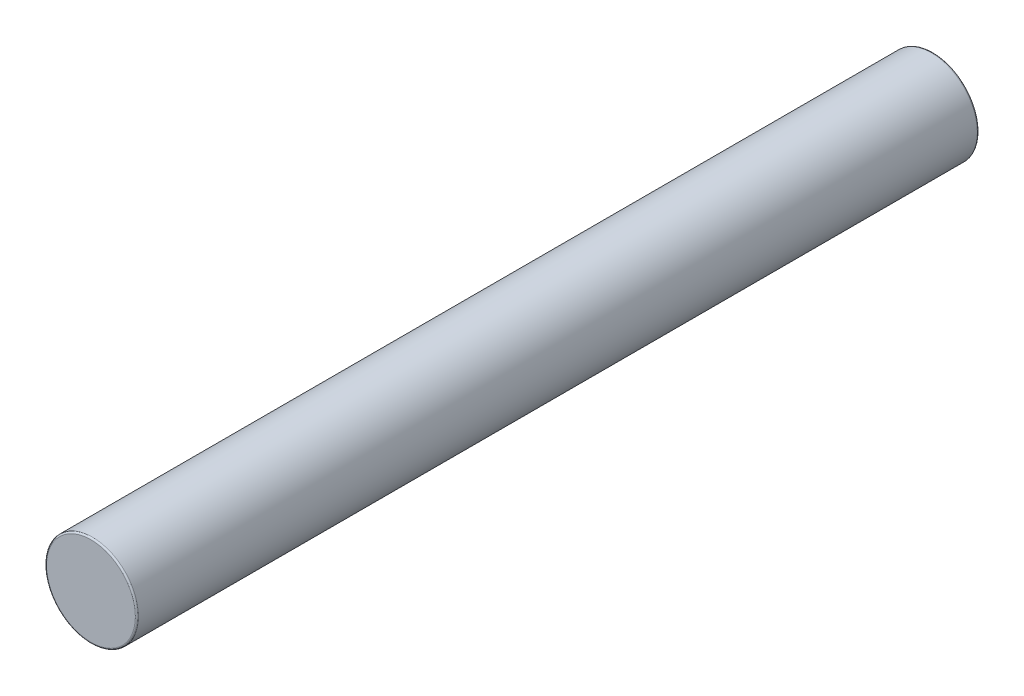
ISO-10303-21;
HEADER;
FILE_DESCRIPTION(('STEP AP214'),'2;1');
FILE_NAME('part.step','',(''),(''),'','','');
FILE_SCHEMA(('AUTOMOTIVE_DESIGN { 1 0 10303 214 1 1 1 1 }'));
ENDSEC;
DATA;
#1=APPLICATION_CONTEXT('core data for automotive mechanical design processes');
#2=APPLICATION_PROTOCOL_DEFINITION('international standard','automotive_design',2000,#1);
#3=PRODUCT_CONTEXT('',#1,'mechanical');
#4=PRODUCT('Part','Part','',(#3));
#5=PRODUCT_RELATED_PRODUCT_CATEGORY('part','',(#4));
#6=PRODUCT_DEFINITION_FORMATION('','',#4);
#7=PRODUCT_DEFINITION_CONTEXT('part definition',#1,'design');
#8=PRODUCT_DEFINITION('design','',#6,#7);
#9=PRODUCT_DEFINITION_SHAPE('','',#8);
#10=(LENGTH_UNIT() NAMED_UNIT(*) SI_UNIT(.MILLI.,.METRE.));
#11=(NAMED_UNIT(*) PLANE_ANGLE_UNIT() SI_UNIT($,.RADIAN.));
#12=(NAMED_UNIT(*) SI_UNIT($,.STERADIAN.) SOLID_ANGLE_UNIT());
#13=UNCERTAINTY_MEASURE_WITH_UNIT(LENGTH_MEASURE(1.E-05),#10,'distance_accuracy_value','');
#14=(GEOMETRIC_REPRESENTATION_CONTEXT(3) GLOBAL_UNCERTAINTY_ASSIGNED_CONTEXT((#13)) GLOBAL_UNIT_ASSIGNED_CONTEXT((#10,
#11,#12)) REPRESENTATION_CONTEXT('',''));
#15=CARTESIAN_POINT('',(0.,0.,0.));
#16=DIRECTION('',(0.,0.,1.));
#17=DIRECTION('',(1.,0.,0.));
#18=AXIS2_PLACEMENT_3D('',#15,#16,#17);
#19=CARTESIAN_POINT('',(0.,0.,55.));
#20=DIRECTION('',(0.,0.,-1.));
#21=DIRECTION('',(-1.,0.,0.));
#22=AXIS2_PLACEMENT_3D('',#19,#20,#21);
#23=CYLINDRICAL_SURFACE('',#22,3.);
#24=CARTESIAN_POINT('',(0.,0.,0.100000000000003));
#25=DIRECTION('',(0.,0.,1.));
#26=DIRECTION('',(1.,0.,0.));
#27=AXIS2_PLACEMENT_3D('',#24,#25,#26);
#28=CIRCLE('',#27,3.);
#29=CARTESIAN_POINT('',(3.,0.,0.100000000000003));
#30=VERTEX_POINT('',#29);
#31=EDGE_CURVE('E44',#30,#30,#28,.T.);
#32=ORIENTED_EDGE('',*,*,#31,.T.);
#33=EDGE_LOOP('',(#32));
#34=FACE_BOUND('',#33,.T.);
#35=CARTESIAN_POINT('',(0.,0.,54.9));
#36=DIRECTION('',(0.,0.,1.));
#37=DIRECTION('',(1.,0.,0.));
#38=AXIS2_PLACEMENT_3D('',#35,#36,#37);
#39=CIRCLE('',#38,3.);
#40=CARTESIAN_POINT('',(3.,0.,54.9));
#41=VERTEX_POINT('',#40);
#42=EDGE_CURVE('E48',#41,#41,#39,.F.);
#43=ORIENTED_EDGE('',*,*,#42,.T.);
#44=EDGE_LOOP('',(#43));
#45=FACE_BOUND('',#44,.T.);
#46=ADVANCED_FACE('F33',(#34,#45),#23,.T.);
#47=CARTESIAN_POINT('',(0.,0.,55.));
#48=DIRECTION('',(0.,0.,1.));
#49=DIRECTION('',(1.,0.,0.));
#50=AXIS2_PLACEMENT_3D('',#47,#48,#49);
#51=PLANE('',#50);
#52=CARTESIAN_POINT('',(0.,0.,55.));
#53=DIRECTION('',(0.,0.,1.));
#54=DIRECTION('',(1.,0.,0.));
#55=AXIS2_PLACEMENT_3D('',#52,#53,#54);
#56=CIRCLE('',#55,2.9);
#57=CARTESIAN_POINT('',(2.9,0.,55.));
#58=VERTEX_POINT('',#57);
#59=EDGE_CURVE('E10',#58,#58,#56,.T.);
#60=ORIENTED_EDGE('',*,*,#59,.T.);
#61=EDGE_LOOP('',(#60));
#62=FACE_BOUND('',#61,.T.);
#63=ADVANCED_FACE('F64',(#62),#51,.T.);
#64=CARTESIAN_POINT('',(0.,0.,0.));
#65=DIRECTION('',(0.,0.,1.));
#66=DIRECTION('',(1.,0.,0.));
#67=AXIS2_PLACEMENT_3D('',#64,#65,#66);
#68=PLANE('',#67);
#69=CARTESIAN_POINT('',(0.,0.,0.));
#70=DIRECTION('',(0.,0.,1.));
#71=DIRECTION('',(1.,0.,0.));
#72=AXIS2_PLACEMENT_3D('',#69,#70,#71);
#73=CIRCLE('',#72,2.9);
#74=CARTESIAN_POINT('',(2.9,0.,0.));
#75=VERTEX_POINT('',#74);
#76=EDGE_CURVE('E40',#75,#75,#73,.F.);
#77=ORIENTED_EDGE('',*,*,#76,.T.);
#78=EDGE_LOOP('',(#77));
#79=FACE_BOUND('',#78,.T.);
#80=ADVANCED_FACE('F61',(#79),#68,.F.);
#81=CARTESIAN_POINT('',(0.,0.,0.100000000000003));
#82=DIRECTION('',(0.,0.,1.));
#83=DIRECTION('',(1.,0.,0.));
#84=AXIS2_PLACEMENT_3D('',#81,#82,#83);
#85=TOROIDAL_SURFACE('',#84,2.9,0.1);
#86=ORIENTED_EDGE('',*,*,#76,.F.);
#87=EDGE_LOOP('',(#86));
#88=FACE_BOUND('',#87,.T.);
#89=ORIENTED_EDGE('',*,*,#31,.F.);
#90=EDGE_LOOP('',(#89));
#91=FACE_BOUND('',#90,.T.);
#92=ADVANCED_FACE('F57',(#88,#91),#85,.T.);
#93=CARTESIAN_POINT('',(0.,0.,54.9));
#94=DIRECTION('',(0.,0.,1.));
#95=DIRECTION('',(1.,0.,0.));
#96=AXIS2_PLACEMENT_3D('',#93,#94,#95);
#97=TOROIDAL_SURFACE('',#96,2.9,0.1);
#98=ORIENTED_EDGE('',*,*,#42,.F.);
#99=EDGE_LOOP('',(#98));
#100=FACE_BOUND('',#99,.T.);
#101=ORIENTED_EDGE('',*,*,#59,.F.);
#102=EDGE_LOOP('',(#101));
#103=FACE_BOUND('',#102,.T.);
#104=ADVANCED_FACE('F35',(#100,#103),#97,.T.);
#105=CLOSED_SHELL('',(#46,#63,#80,#92,#104));
#106=MANIFOLD_SOLID_BREP('B2',#105);
#107=ADVANCED_BREP_SHAPE_REPRESENTATION('',(#18,#106),#14);
#108=SHAPE_DEFINITION_REPRESENTATION(#9,#107);
ENDSEC;
END-ISO-10303-21;
